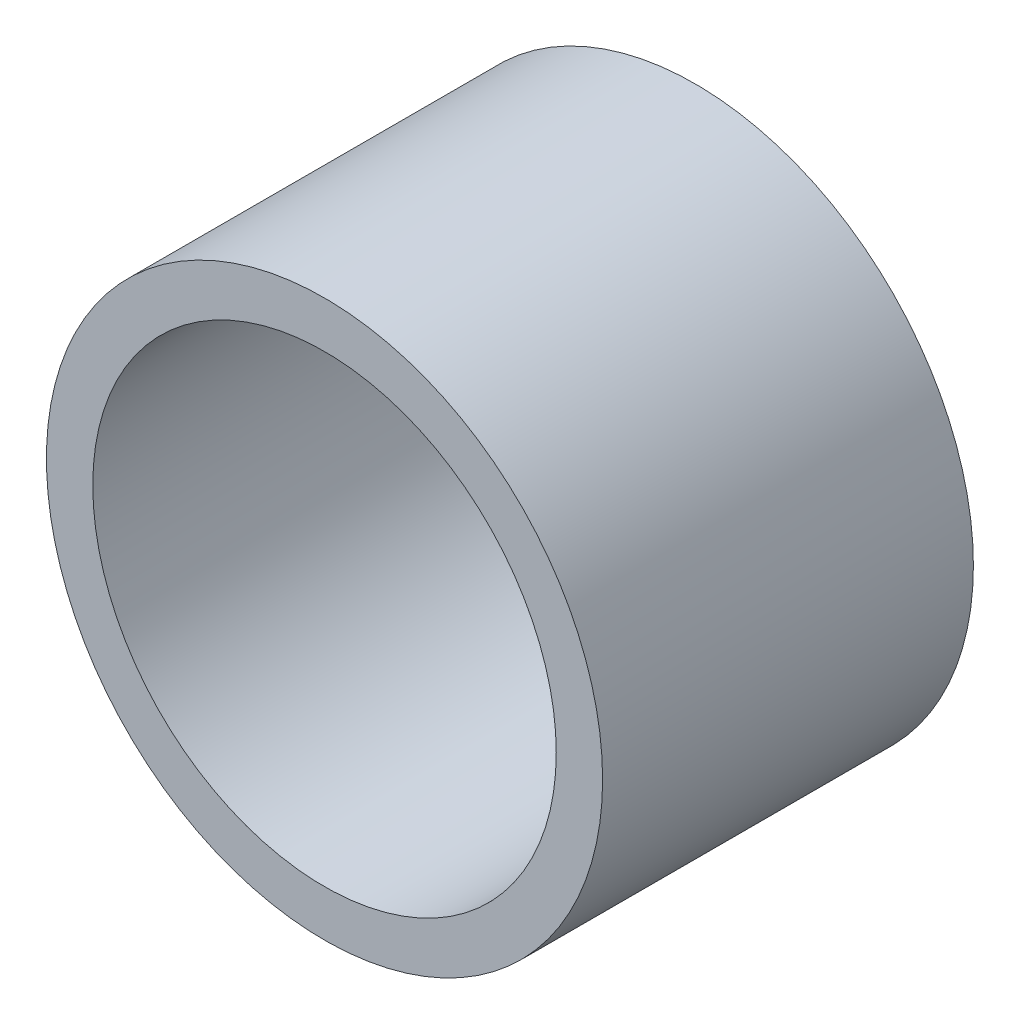
ISO-10303-21;
HEADER;
FILE_DESCRIPTION(('STEP AP214'),'2;1');
FILE_NAME('part.step','',(''),(''),'','','');
FILE_SCHEMA(('AUTOMOTIVE_DESIGN { 1 0 10303 214 1 1 1 1 }'));
ENDSEC;
DATA;
#1=APPLICATION_CONTEXT('core data for automotive mechanical design processes');
#2=APPLICATION_PROTOCOL_DEFINITION('international standard','automotive_design',2000,#1);
#3=PRODUCT_CONTEXT('',#1,'mechanical');
#4=PRODUCT('Part','Part','',(#3));
#5=PRODUCT_RELATED_PRODUCT_CATEGORY('part','',(#4));
#6=PRODUCT_DEFINITION_FORMATION('','',#4);
#7=PRODUCT_DEFINITION_CONTEXT('part definition',#1,'design');
#8=PRODUCT_DEFINITION('design','',#6,#7);
#9=PRODUCT_DEFINITION_SHAPE('','',#8);
#10=(LENGTH_UNIT() NAMED_UNIT(*) SI_UNIT(.MILLI.,.METRE.));
#11=(NAMED_UNIT(*) PLANE_ANGLE_UNIT() SI_UNIT($,.RADIAN.));
#12=(NAMED_UNIT(*) SI_UNIT($,.STERADIAN.) SOLID_ANGLE_UNIT());
#13=UNCERTAINTY_MEASURE_WITH_UNIT(LENGTH_MEASURE(1.E-05),#10,'distance_accuracy_value','');
#14=(GEOMETRIC_REPRESENTATION_CONTEXT(3) GLOBAL_UNCERTAINTY_ASSIGNED_CONTEXT((#13)) GLOBAL_UNIT_ASSIGNED_CONTEXT((#10,
#11,#12)) REPRESENTATION_CONTEXT('',''));
#15=CARTESIAN_POINT('',(0.,0.,0.));
#16=DIRECTION('',(0.,0.,1.));
#17=DIRECTION('',(1.,0.,0.));
#18=AXIS2_PLACEMENT_3D('',#15,#16,#17);
#19=CARTESIAN_POINT('',(0.,0.,4.));
#20=DIRECTION('',(0.,0.,1.));
#21=DIRECTION('',(1.,0.,0.));
#22=AXIS2_PLACEMENT_3D('',#19,#20,#21);
#23=PLANE('',#22);
#24=CARTESIAN_POINT('',(0.,0.,4.));
#25=DIRECTION('',(0.,0.,1.));
#26=DIRECTION('',(1.,0.,0.));
#27=AXIS2_PLACEMENT_3D('',#24,#25,#26);
#28=CIRCLE('',#27,3.);
#29=CARTESIAN_POINT('',(3.,0.,4.));
#30=VERTEX_POINT('',#29);
#31=EDGE_CURVE('E10',#30,#30,#28,.T.);
#32=ORIENTED_EDGE('',*,*,#31,.T.);
#33=EDGE_LOOP('',(#32));
#34=FACE_BOUND('',#33,.T.);
#35=CARTESIAN_POINT('',(0.,0.,4.));
#36=DIRECTION('',(0.,0.,1.));
#37=DIRECTION('',(1.,0.,0.));
#38=AXIS2_PLACEMENT_3D('',#35,#36,#37);
#39=CIRCLE('',#38,2.5);
#40=CARTESIAN_POINT('',(2.5,0.,4.));
#41=VERTEX_POINT('',#40);
#42=EDGE_CURVE('E42',#41,#41,#39,.T.);
#43=ORIENTED_EDGE('',*,*,#42,.F.);
#44=EDGE_LOOP('',(#43));
#45=FACE_BOUND('',#44,.T.);
#46=ADVANCED_FACE('F31',(#34,#45),#23,.T.);
#47=CARTESIAN_POINT('',(0.,0.,0.));
#48=DIRECTION('',(0.,0.,1.));
#49=DIRECTION('',(1.,0.,0.));
#50=AXIS2_PLACEMENT_3D('',#47,#48,#49);
#51=PLANE('',#50);
#52=CARTESIAN_POINT('',(0.,0.,0.));
#53=DIRECTION('',(0.,0.,1.));
#54=DIRECTION('',(1.,0.,0.));
#55=AXIS2_PLACEMENT_3D('',#52,#53,#54);
#56=CIRCLE('',#55,3.);
#57=CARTESIAN_POINT('',(3.,0.,0.));
#58=VERTEX_POINT('',#57);
#59=EDGE_CURVE('E35',#58,#58,#56,.T.);
#60=ORIENTED_EDGE('',*,*,#59,.F.);
#61=EDGE_LOOP('',(#60));
#62=FACE_BOUND('',#61,.T.);
#63=CARTESIAN_POINT('',(0.,0.,0.));
#64=DIRECTION('',(0.,0.,1.));
#65=DIRECTION('',(1.,0.,0.));
#66=AXIS2_PLACEMENT_3D('',#63,#64,#65);
#67=CIRCLE('',#66,2.5);
#68=CARTESIAN_POINT('',(2.5,0.,0.));
#69=VERTEX_POINT('',#68);
#70=EDGE_CURVE('E44',#69,#69,#67,.T.);
#71=ORIENTED_EDGE('',*,*,#70,.T.);
#72=EDGE_LOOP('',(#71));
#73=FACE_BOUND('',#72,.T.);
#74=ADVANCED_FACE('F54',(#62,#73),#51,.F.);
#75=CARTESIAN_POINT('',(0.,0.,4.));
#76=DIRECTION('',(0.,0.,-1.));
#77=DIRECTION('',(-1.,0.,0.));
#78=AXIS2_PLACEMENT_3D('',#75,#76,#77);
#79=CYLINDRICAL_SURFACE('',#78,3.);
#80=ORIENTED_EDGE('',*,*,#31,.F.);
#81=EDGE_LOOP('',(#80));
#82=FACE_BOUND('',#81,.T.);
#83=ORIENTED_EDGE('',*,*,#59,.T.);
#84=EDGE_LOOP('',(#83));
#85=FACE_BOUND('',#84,.T.);
#86=ADVANCED_FACE('F33',(#82,#85),#79,.T.);
#87=CARTESIAN_POINT('',(0.,0.,4.));
#88=DIRECTION('',(0.,0.,-1.));
#89=DIRECTION('',(-1.,0.,0.));
#90=AXIS2_PLACEMENT_3D('',#87,#88,#89);
#91=CYLINDRICAL_SURFACE('',#90,2.5);
#92=ORIENTED_EDGE('',*,*,#42,.T.);
#93=EDGE_LOOP('',(#92));
#94=FACE_BOUND('',#93,.T.);
#95=ORIENTED_EDGE('',*,*,#70,.F.);
#96=EDGE_LOOP('',(#95));
#97=FACE_BOUND('',#96,.T.);
#98=ADVANCED_FACE('F50',(#94,#97),#91,.F.);
#99=CLOSED_SHELL('',(#46,#74,#86,#98));
#100=MANIFOLD_SOLID_BREP('B2',#99);
#101=ADVANCED_BREP_SHAPE_REPRESENTATION('',(#18,#100),#14);
#102=SHAPE_DEFINITION_REPRESENTATION(#9,#101);
ENDSEC;
END-ISO-10303-21;
